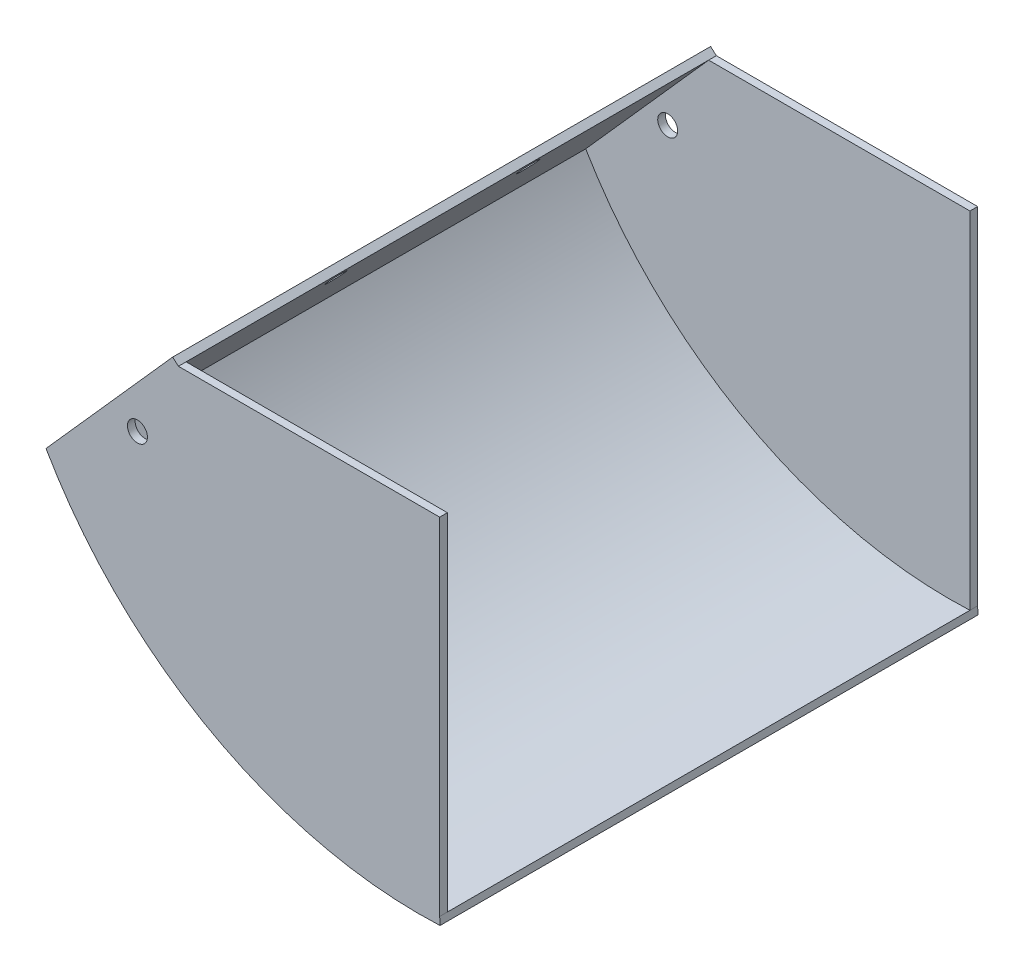
ISO-10303-21;
HEADER;
FILE_DESCRIPTION(('STEP AP214'),'2;1');
FILE_NAME('part.step','',(''),(''),'','','');
FILE_SCHEMA(('AUTOMOTIVE_DESIGN { 1 0 10303 214 1 1 1 1 }'));
ENDSEC;
DATA;
#1=APPLICATION_CONTEXT('core data for automotive mechanical design processes');
#2=APPLICATION_PROTOCOL_DEFINITION('international standard','automotive_design',2000,#1);
#3=PRODUCT_CONTEXT('',#1,'mechanical');
#4=PRODUCT('Part','Part','',(#3));
#5=PRODUCT_RELATED_PRODUCT_CATEGORY('part','',(#4));
#6=PRODUCT_DEFINITION_FORMATION('','',#4);
#7=PRODUCT_DEFINITION_CONTEXT('part definition',#1,'design');
#8=PRODUCT_DEFINITION('design','',#6,#7);
#9=PRODUCT_DEFINITION_SHAPE('','',#8);
#10=(LENGTH_UNIT() NAMED_UNIT(*) SI_UNIT(.MILLI.,.METRE.));
#11=(NAMED_UNIT(*) PLANE_ANGLE_UNIT() SI_UNIT($,.RADIAN.));
#12=(NAMED_UNIT(*) SI_UNIT($,.STERADIAN.) SOLID_ANGLE_UNIT());
#13=UNCERTAINTY_MEASURE_WITH_UNIT(LENGTH_MEASURE(1.E-05),#10,'distance_accuracy_value','');
#14=(GEOMETRIC_REPRESENTATION_CONTEXT(3) GLOBAL_UNCERTAINTY_ASSIGNED_CONTEXT((#13)) GLOBAL_UNIT_ASSIGNED_CONTEXT((#10,
#11,#12)) REPRESENTATION_CONTEXT('',''));
#15=CARTESIAN_POINT('',(0.,0.,0.));
#16=DIRECTION('',(0.,0.,1.));
#17=DIRECTION('',(1.,0.,0.));
#18=AXIS2_PLACEMENT_3D('',#15,#16,#17);
#19=CARTESIAN_POINT('',(11.7523691350774,4.87475765755079,-101.5));
#20=DIRECTION('',(0.,0.,-1.));
#21=DIRECTION('',(1.,0.,0.));
#22=AXIS2_PLACEMENT_3D('',#19,#20,#21);
#23=PLANE('',#22);
#24=CARTESIAN_POINT('',(-61.6593417472566,-35.0203309303676,-101.5));
#25=DIRECTION('',(0.,0.,-1.));
#26=DIRECTION('',(-1.,0.,0.));
#27=AXIS2_PLACEMENT_3D('',#24,#25,#26);
#28=CIRCLE('',#27,2.6);
#29=CARTESIAN_POINT('',(-64.2593417472566,-35.0203309303676,-101.5));
#30=VERTEX_POINT('',#29);
#31=EDGE_CURVE('E193',#30,#30,#28,.T.);
#32=ORIENTED_EDGE('',*,*,#31,.F.);
#33=EDGE_LOOP('',(#32));
#34=FACE_BOUND('',#33,.T.);
#35=DIRECTION('',(0.74740931868366,-0.66436383882992,0.));
#36=VECTOR('',#35,1.);
#37=CARTESIAN_POINT('',(-52.4948186373673,-13.6712723223402,-101.5));
#38=LINE('',#37,#36);
#39=CARTESIAN_POINT('',(-52.4948186373673,-13.6712723223402,-101.5));
#40=VERTEX_POINT('',#39);
#41=CARTESIAN_POINT('',(-51.,-15.,-101.5));
#42=VERTEX_POINT('',#41);
#43=EDGE_CURVE('E138',#40,#42,#38,.T.);
#44=ORIENTED_EDGE('',*,*,#43,.T.);
#45=DIRECTION('',(-1.,0.,0.));
#46=VECTOR('',#45,1.);
#47=CARTESIAN_POINT('',(-51.,-15.,-101.5));
#48=LINE('',#47,#46);
#49=CARTESIAN_POINT('',(17.,-15.,-101.5));
#50=VERTEX_POINT('',#49);
#51=EDGE_CURVE('E144',#50,#42,#48,.T.);
#52=ORIENTED_EDGE('',*,*,#51,.F.);
#53=DIRECTION('',(0.,1.,0.));
#54=VECTOR('',#53,1.);
#55=CARTESIAN_POINT('',(17.,-15.,-101.5));
#56=LINE('',#55,#54);
#57=CARTESIAN_POINT('',(16.9999999999999,-105.,-101.5));
#58=VERTEX_POINT('',#57);
#59=EDGE_CURVE('E141',#58,#50,#56,.T.);
#60=ORIENTED_EDGE('',*,*,#59,.F.);
#61=DIRECTION('',(0.0477057351356576,-0.998861433250462,0.));
#62=VECTOR('',#61,1.);
#63=CARTESIAN_POINT('',(16.9999999999999,-105.,-101.5));
#64=LINE('',#63,#62);
#65=CARTESIAN_POINT('',(17.0954114702712,-106.997722866501,-101.5));
#66=VERTEX_POINT('',#65);
#67=EDGE_CURVE('E125',#58,#66,#64,.T.);
#68=ORIENTED_EDGE('',*,*,#67,.T.);
#69=CARTESIAN_POINT('',(11.7523691350774,4.87475765755079,-101.5));
#70=DIRECTION('',(0.,0.,-1.));
#71=DIRECTION('',(-1.,0.,0.));
#72=AXIS2_PLACEMENT_3D('',#69,#70,#71);
#73=CIRCLE('',#72,112.);
#74=CARTESIAN_POINT('',(-85.4564064699669,-50.7530586340146,-101.5));
#75=VERTEX_POINT('',#74);
#76=EDGE_CURVE('E209',#75,#66,#73,.F.);
#77=ORIENTED_EDGE('',*,*,#76,.F.);
#78=DIRECTION('',(-0.66436383882992,-0.747409318683659,0.));
#79=VECTOR('',#78,1.);
#80=CARTESIAN_POINT('',(-52.4948186373673,-13.6712723223402,-101.5));
#81=LINE('',#80,#79);
#82=EDGE_CURVE('E225',#40,#75,#81,.T.);
#83=ORIENTED_EDGE('',*,*,#82,.F.);
#84=EDGE_LOOP('',(#44,#52,#60,#68,#77,#83));
#85=FACE_BOUND('',#84,.T.);
#86=ADVANCED_FACE('F40',(#34,#85),#23,.T.);
#87=CARTESIAN_POINT('',(-36.091868623584,-36.2794020537869,-6.49999999999999));
#88=DIRECTION('',(-0.747409318683659,0.66436383882992,0.));
#89=DIRECTION('',(-0.66436383882992,-0.747409318683659,0.));
#90=AXIS2_PLACEMENT_3D('',#87,#88,#89);
#91=CYLINDRICAL_SURFACE('',#90,2.5);
#92=CARTESIAN_POINT('',(-56.4810016703469,-18.1557282344421,-6.49999999999999));
#93=DIRECTION('',(-0.747409318683659,0.66436383882992,0.));
#94=DIRECTION('',(-0.66436383882992,-0.747409318683659,0.));
#95=AXIS2_PLACEMENT_3D('',#92,#93,#94);
#96=CIRCLE('',#95,2.5);
#97=CARTESIAN_POINT('',(-58.1419112674217,-20.0242515311513,-6.49999999999999));
#98=VERTEX_POINT('',#97);
#99=EDGE_CURVE('E192',#98,#98,#96,.T.);
#100=ORIENTED_EDGE('',*,*,#99,.T.);
#101=EDGE_LOOP('',(#100));
#102=FACE_BOUND('',#101,.T.);
#103=CARTESIAN_POINT('',(-54.9861830329795,-19.484455912102,-6.49999999999999));
#104=DIRECTION('',(-0.747409318683659,0.66436383882992,0.));
#105=DIRECTION('',(-0.66436383882992,-0.747409318683659,0.));
#106=AXIS2_PLACEMENT_3D('',#103,#104,#105);
#107=CIRCLE('',#106,2.5);
#108=CARTESIAN_POINT('',(-56.6470926300543,-21.3529792088111,-6.49999999999999));
#109=VERTEX_POINT('',#108);
#110=EDGE_CURVE('E202',#109,#109,#107,.T.);
#111=ORIENTED_EDGE('',*,*,#110,.F.);
#112=EDGE_LOOP('',(#111));
#113=FACE_BOUND('',#112,.T.);
#114=ADVANCED_FACE('F290',(#102,#113),#91,.F.);
#115=CARTESIAN_POINT('',(-36.091868623584,-36.2794020537869,-56.5));
#116=DIRECTION('',(-0.747409318683659,0.66436383882992,0.));
#117=DIRECTION('',(-0.66436383882992,-0.747409318683659,0.));
#118=AXIS2_PLACEMENT_3D('',#115,#116,#117);
#119=CYLINDRICAL_SURFACE('',#118,2.6);
#120=CARTESIAN_POINT('',(-56.4810016703469,-18.1557282344421,-56.5));
#121=DIRECTION('',(-0.747409318683659,0.66436383882992,0.));
#122=DIRECTION('',(-0.66436383882992,-0.747409318683659,0.));
#123=AXIS2_PLACEMENT_3D('',#120,#121,#122);
#124=CIRCLE('',#123,2.6);
#125=CARTESIAN_POINT('',(-58.2083476513047,-20.0989924630196,-56.5));
#126=VERTEX_POINT('',#125);
#127=EDGE_CURVE('E196',#126,#126,#124,.T.);
#128=ORIENTED_EDGE('',*,*,#127,.T.);
#129=EDGE_LOOP('',(#128));
#130=FACE_BOUND('',#129,.T.);
#131=CARTESIAN_POINT('',(-54.9861830329795,-19.484455912102,-56.5));
#132=DIRECTION('',(-0.747409318683659,0.66436383882992,0.));
#133=DIRECTION('',(-0.66436383882992,-0.747409318683659,0.));
#134=AXIS2_PLACEMENT_3D('',#131,#132,#133);
#135=CIRCLE('',#134,2.6);
#136=CARTESIAN_POINT('',(-56.7135290139373,-21.4277201406795,-56.5));
#137=VERTEX_POINT('',#136);
#138=EDGE_CURVE('E206',#137,#137,#135,.T.);
#139=ORIENTED_EDGE('',*,*,#138,.F.);
#140=EDGE_LOOP('',(#139));
#141=FACE_BOUND('',#140,.T.);
#142=ADVANCED_FACE('F303',(#130,#141),#119,.F.);
#143=CARTESIAN_POINT('',(16.9999999999999,-105.,-240.246242743244));
#144=DIRECTION('',(-0.998861433250462,-0.0477057351356576,0.));
#145=DIRECTION('',(0.0477057351356576,-0.998861433250462,0.));
#146=AXIS2_PLACEMENT_3D('',#143,#144,#145);
#147=PLANE('',#146);
#148=ORIENTED_EDGE('',*,*,#67,.F.);
#149=DIRECTION('',(0.,0.,1.));
#150=VECTOR('',#149,1.);
#151=CARTESIAN_POINT('',(17.,-105.,-101.5));
#152=LINE('',#151,#150);
#153=CARTESIAN_POINT('',(17.,-105.,-99.5));
#154=VERTEX_POINT('',#153);
#155=EDGE_CURVE('E130',#58,#154,#152,.T.);
#156=ORIENTED_EDGE('',*,*,#155,.T.);
#157=DIRECTION('',(0.,0.,1.));
#158=VECTOR('',#157,1.);
#159=CARTESIAN_POINT('',(16.9999999999999,-105.,-240.246242743244));
#160=LINE('',#159,#158);
#161=CARTESIAN_POINT('',(16.9999999999999,-105.,36.5));
#162=VERTEX_POINT('',#161);
#163=EDGE_CURVE('E221',#154,#162,#160,.T.);
#164=ORIENTED_EDGE('',*,*,#163,.T.);
#165=DIRECTION('',(0.,0.,-1.));
#166=VECTOR('',#165,1.);
#167=CARTESIAN_POINT('',(17.,-105.,38.5));
#168=LINE('',#167,#166);
#169=CARTESIAN_POINT('',(17.,-105.,38.5));
#170=VERTEX_POINT('',#169);
#171=EDGE_CURVE('E175',#170,#162,#168,.T.);
#172=ORIENTED_EDGE('',*,*,#171,.F.);
#173=DIRECTION('',(0.0477057351356576,-0.998861433250462,0.));
#174=VECTOR('',#173,1.);
#175=CARTESIAN_POINT('',(16.9999999999999,-105.,38.5));
#176=LINE('',#175,#174);
#177=CARTESIAN_POINT('',(17.0954114702712,-106.997722866501,38.5));
#178=VERTEX_POINT('',#177);
#179=EDGE_CURVE('E219',#170,#178,#176,.T.);
#180=ORIENTED_EDGE('',*,*,#179,.T.);
#181=DIRECTION('',(0.,0.,1.));
#182=VECTOR('',#181,1.);
#183=CARTESIAN_POINT('',(17.0954114702712,-106.997722866501,-240.246242743244));
#184=LINE('',#183,#182);
#185=EDGE_CURVE('E133',#66,#178,#184,.T.);
#186=ORIENTED_EDGE('',*,*,#185,.F.);
#187=EDGE_LOOP('',(#148,#156,#164,#172,#180,#186));
#188=FACE_BOUND('',#187,.T.);
#189=ADVANCED_FACE('F127',(#188),#147,.F.);
#190=CARTESIAN_POINT('',(11.7523691350774,4.87475765755079,-240.246242743244));
#191=DIRECTION('',(0.,0.,1.));
#192=DIRECTION('',(1.,0.,0.));
#193=AXIS2_PLACEMENT_3D('',#190,#191,#192);
#194=CYLINDRICAL_SURFACE('',#193,112.);
#195=DIRECTION('',(0.,0.,1.));
#196=VECTOR('',#195,1.);
#197=CARTESIAN_POINT('',(-85.4564064699669,-50.7530586340146,-240.246242743244));
#198=LINE('',#197,#196);
#199=CARTESIAN_POINT('',(-85.4564064699669,-50.7530586340146,38.5));
#200=VERTEX_POINT('',#199);
#201=EDGE_CURVE('E227',#75,#200,#198,.T.);
#202=ORIENTED_EDGE('',*,*,#201,.F.);
#203=ORIENTED_EDGE('',*,*,#76,.T.);
#204=ORIENTED_EDGE('',*,*,#185,.T.);
#205=CARTESIAN_POINT('',(11.7523691350774,4.87475765755079,38.5));
#206=DIRECTION('',(0.,0.,1.));
#207=DIRECTION('',(1.,0.,0.));
#208=AXIS2_PLACEMENT_3D('',#205,#206,#207);
#209=CIRCLE('',#208,112.);
#210=EDGE_CURVE('E213',#200,#178,#209,.T.);
#211=ORIENTED_EDGE('',*,*,#210,.F.);
#212=EDGE_LOOP('',(#202,#203,#204,#211));
#213=FACE_BOUND('',#212,.T.);
#214=ADVANCED_FACE('F259',(#213),#194,.T.);
#215=CARTESIAN_POINT('',(-52.4948186373673,-13.6712723223402,-240.246242743244));
#216=DIRECTION('',(-0.747409318683659,0.66436383882992,0.));
#217=DIRECTION('',(-0.66436383882992,-0.747409318683659,0.));
#218=AXIS2_PLACEMENT_3D('',#215,#216,#217);
#219=PLANE('',#218);
#220=ORIENTED_EDGE('',*,*,#127,.F.);
#221=EDGE_LOOP('',(#220));
#222=FACE_BOUND('',#221,.T.);
#223=ORIENTED_EDGE('',*,*,#99,.F.);
#224=EDGE_LOOP('',(#223));
#225=FACE_BOUND('',#224,.T.);
#226=DIRECTION('',(0.,0.,1.));
#227=VECTOR('',#226,1.);
#228=CARTESIAN_POINT('',(-52.4948186373673,-13.6712723223402,-240.246242743244));
#229=LINE('',#228,#227);
#230=CARTESIAN_POINT('',(-52.4948186373673,-13.6712723223402,38.5));
#231=VERTEX_POINT('',#230);
#232=EDGE_CURVE('E218',#40,#231,#229,.T.);
#233=ORIENTED_EDGE('',*,*,#232,.F.);
#234=ORIENTED_EDGE('',*,*,#82,.T.);
#235=ORIENTED_EDGE('',*,*,#201,.T.);
#236=DIRECTION('',(-0.66436383882992,-0.747409318683659,0.));
#237=VECTOR('',#236,1.);
#238=CARTESIAN_POINT('',(-52.4948186373673,-13.6712723223402,38.5));
#239=LINE('',#238,#237);
#240=EDGE_CURVE('E210',#231,#200,#239,.T.);
#241=ORIENTED_EDGE('',*,*,#240,.F.);
#242=EDGE_LOOP('',(#233,#234,#235,#241));
#243=FACE_BOUND('',#242,.T.);
#244=ADVANCED_FACE('F255',(#222,#225,#243),#219,.T.);
#245=CARTESIAN_POINT('',(-52.4948186373673,-13.6712723223402,-240.246242743244));
#246=DIRECTION('',(-0.66436383882992,-0.74740931868366,0.));
#247=DIRECTION('',(0.74740931868366,-0.66436383882992,0.));
#248=AXIS2_PLACEMENT_3D('',#245,#246,#247);
#249=PLANE('',#248);
#250=ORIENTED_EDGE('',*,*,#43,.F.);
#251=ORIENTED_EDGE('',*,*,#232,.T.);
#252=DIRECTION('',(0.74740931868366,-0.66436383882992,0.));
#253=VECTOR('',#252,1.);
#254=CARTESIAN_POINT('',(-52.4948186373673,-13.6712723223402,38.5));
#255=LINE('',#254,#253);
#256=CARTESIAN_POINT('',(-51.,-15.,38.5));
#257=VERTEX_POINT('',#256);
#258=EDGE_CURVE('E214',#231,#257,#255,.T.);
#259=ORIENTED_EDGE('',*,*,#258,.T.);
#260=DIRECTION('',(0.,0.,-1.));
#261=VECTOR('',#260,1.);
#262=CARTESIAN_POINT('',(-51.,-15.,38.5));
#263=LINE('',#262,#261);
#264=CARTESIAN_POINT('',(-51.,-15.,36.5));
#265=VERTEX_POINT('',#264);
#266=EDGE_CURVE('E166',#257,#265,#263,.T.);
#267=ORIENTED_EDGE('',*,*,#266,.T.);
#268=DIRECTION('',(0.,0.,1.));
#269=VECTOR('',#268,1.);
#270=CARTESIAN_POINT('',(-51.,-15.,-240.246242743244));
#271=LINE('',#270,#269);
#272=CARTESIAN_POINT('',(-51.,-15.,-99.5));
#273=VERTEX_POINT('',#272);
#274=EDGE_CURVE('E217',#273,#265,#271,.T.);
#275=ORIENTED_EDGE('',*,*,#274,.F.);
#276=DIRECTION('',(0.,0.,1.));
#277=VECTOR('',#276,1.);
#278=CARTESIAN_POINT('',(-51.,-15.,-101.5));
#279=LINE('',#278,#277);
#280=EDGE_CURVE('E161',#42,#273,#279,.T.);
#281=ORIENTED_EDGE('',*,*,#280,.F.);
#282=EDGE_LOOP('',(#250,#251,#259,#267,#275,#281));
#283=FACE_BOUND('',#282,.T.);
#284=ADVANCED_FACE('F250',(#283),#249,.F.);
#285=CARTESIAN_POINT('',(-51.,-15.,-101.5));
#286=DIRECTION('',(0.,-1.,0.));
#287=DIRECTION('',(0.,0.,1.));
#288=AXIS2_PLACEMENT_3D('',#285,#286,#287);
#289=PLANE('',#288);
#290=DIRECTION('',(-1.,0.,0.));
#291=VECTOR('',#290,1.);
#292=CARTESIAN_POINT('',(-51.,-15.,-99.5));
#293=LINE('',#292,#291);
#294=CARTESIAN_POINT('',(17.,-15.,-99.5));
#295=VERTEX_POINT('',#294);
#296=EDGE_CURVE('E148',#295,#273,#293,.T.);
#297=ORIENTED_EDGE('',*,*,#296,.F.);
#298=DIRECTION('',(0.,0.,1.));
#299=VECTOR('',#298,1.);
#300=CARTESIAN_POINT('',(17.,-15.,-101.5));
#301=LINE('',#300,#299);
#302=EDGE_CURVE('E156',#50,#295,#301,.T.);
#303=ORIENTED_EDGE('',*,*,#302,.F.);
#304=ORIENTED_EDGE('',*,*,#51,.T.);
#305=ORIENTED_EDGE('',*,*,#280,.T.);
#306=EDGE_LOOP('',(#297,#303,#304,#305));
#307=FACE_BOUND('',#306,.T.);
#308=ADVANCED_FACE('F247',(#307),#289,.F.);
#309=CARTESIAN_POINT('',(17.,-15.,-101.5));
#310=DIRECTION('',(-1.,0.,0.));
#311=DIRECTION('',(0.,0.,-1.));
#312=AXIS2_PLACEMENT_3D('',#309,#310,#311);
#313=PLANE('',#312);
#314=DIRECTION('',(0.,1.,0.));
#315=VECTOR('',#314,1.);
#316=CARTESIAN_POINT('',(17.,-15.,-99.5));
#317=LINE('',#316,#315);
#318=EDGE_CURVE('E153',#154,#295,#317,.T.);
#319=ORIENTED_EDGE('',*,*,#318,.F.);
#320=ORIENTED_EDGE('',*,*,#155,.F.);
#321=ORIENTED_EDGE('',*,*,#59,.T.);
#322=ORIENTED_EDGE('',*,*,#302,.T.);
#323=EDGE_LOOP('',(#319,#320,#321,#322));
#324=FACE_BOUND('',#323,.T.);
#325=ADVANCED_FACE('F151',(#324),#313,.F.);
#326=CARTESIAN_POINT('',(11.7523691350774,4.87475765755079,-240.246242743244));
#327=DIRECTION('',(0.,0.,1.));
#328=DIRECTION('',(1.,0.,0.));
#329=AXIS2_PLACEMENT_3D('',#326,#327,#328);
#330=CYLINDRICAL_SURFACE('',#329,110.);
#331=DIRECTION('',(0.,0.,1.));
#332=VECTOR('',#331,1.);
#333=CARTESIAN_POINT('',(-83.,-51.,-240.246242743244));
#334=LINE('',#333,#332);
#335=CARTESIAN_POINT('',(-83.,-51.,-99.5));
#336=VERTEX_POINT('',#335);
#337=CARTESIAN_POINT('',(-83.,-51.,36.5));
#338=VERTEX_POINT('',#337);
#339=EDGE_CURVE('E233',#336,#338,#334,.T.);
#340=ORIENTED_EDGE('',*,*,#339,.T.);
#341=CARTESIAN_POINT('',(11.7523691350774,4.87475765755079,36.5));
#342=DIRECTION('',(0.,0.,1.));
#343=DIRECTION('',(1.,0.,0.));
#344=AXIS2_PLACEMENT_3D('',#341,#342,#343);
#345=CIRCLE('',#344,110.);
#346=EDGE_CURVE('E159',#338,#162,#345,.T.);
#347=ORIENTED_EDGE('',*,*,#346,.T.);
#348=ORIENTED_EDGE('',*,*,#163,.F.);
#349=CARTESIAN_POINT('',(11.7523691350774,4.87475765755079,-99.5));
#350=DIRECTION('',(0.,0.,1.));
#351=DIRECTION('',(1.,0.,0.));
#352=AXIS2_PLACEMENT_3D('',#349,#350,#351);
#353=CIRCLE('',#352,110.);
#354=EDGE_CURVE('E241',#336,#154,#353,.T.);
#355=ORIENTED_EDGE('',*,*,#354,.F.);
#356=EDGE_LOOP('',(#340,#347,#348,#355));
#357=FACE_BOUND('',#356,.T.);
#358=ADVANCED_FACE('F267',(#357),#330,.F.);
#359=CARTESIAN_POINT('',(17.,-15.,38.5));
#360=DIRECTION('',(-1.,0.,0.));
#361=DIRECTION('',(0.,0.,1.));
#362=AXIS2_PLACEMENT_3D('',#359,#360,#361);
#363=PLANE('',#362);
#364=DIRECTION('',(0.,1.,0.));
#365=VECTOR('',#364,1.);
#366=CARTESIAN_POINT('',(17.,-15.,36.5));
#367=LINE('',#366,#365);
#368=CARTESIAN_POINT('',(17.,-15.,36.5));
#369=VERTEX_POINT('',#368);
#370=EDGE_CURVE('E73',#162,#369,#367,.T.);
#371=ORIENTED_EDGE('',*,*,#370,.T.);
#372=DIRECTION('',(0.,0.,-1.));
#373=VECTOR('',#372,1.);
#374=CARTESIAN_POINT('',(17.,-15.,38.5));
#375=LINE('',#374,#373);
#376=CARTESIAN_POINT('',(17.,-15.,38.5));
#377=VERTEX_POINT('',#376);
#378=EDGE_CURVE('E174',#377,#369,#375,.T.);
#379=ORIENTED_EDGE('',*,*,#378,.F.);
#380=DIRECTION('',(0.,1.,0.));
#381=VECTOR('',#380,1.);
#382=CARTESIAN_POINT('',(17.,-15.,38.5));
#383=LINE('',#382,#381);
#384=EDGE_CURVE('E81',#170,#377,#383,.T.);
#385=ORIENTED_EDGE('',*,*,#384,.F.);
#386=ORIENTED_EDGE('',*,*,#171,.T.);
#387=EDGE_LOOP('',(#371,#379,#385,#386));
#388=FACE_BOUND('',#387,.T.);
#389=ADVANCED_FACE('F42',(#388),#363,.F.);
#390=CARTESIAN_POINT('',(-51.,-15.,38.5));
#391=DIRECTION('',(0.,-1.,0.));
#392=DIRECTION('',(0.,0.,-1.));
#393=AXIS2_PLACEMENT_3D('',#390,#391,#392);
#394=PLANE('',#393);
#395=DIRECTION('',(-1.,0.,0.));
#396=VECTOR('',#395,1.);
#397=CARTESIAN_POINT('',(-51.,-15.,36.5));
#398=LINE('',#397,#396);
#399=EDGE_CURVE('E78',#369,#265,#398,.T.);
#400=ORIENTED_EDGE('',*,*,#399,.T.);
#401=ORIENTED_EDGE('',*,*,#266,.F.);
#402=DIRECTION('',(-1.,0.,0.));
#403=VECTOR('',#402,1.);
#404=CARTESIAN_POINT('',(-51.,-15.,38.5));
#405=LINE('',#404,#403);
#406=EDGE_CURVE('E58',#377,#257,#405,.T.);
#407=ORIENTED_EDGE('',*,*,#406,.F.);
#408=ORIENTED_EDGE('',*,*,#378,.T.);
#409=EDGE_LOOP('',(#400,#401,#407,#408));
#410=FACE_BOUND('',#409,.T.);
#411=ADVANCED_FACE('F268',(#410),#394,.F.);
#412=CARTESIAN_POINT('',(-51.,-15.,-240.246242743244));
#413=DIRECTION('',(-0.747409318683659,0.66436383882992,0.));
#414=DIRECTION('',(-0.66436383882992,-0.747409318683659,0.));
#415=AXIS2_PLACEMENT_3D('',#412,#413,#414);
#416=PLANE('',#415);
#417=ORIENTED_EDGE('',*,*,#138,.T.);
#418=EDGE_LOOP('',(#417));
#419=FACE_BOUND('',#418,.T.);
#420=ORIENTED_EDGE('',*,*,#110,.T.);
#421=EDGE_LOOP('',(#420));
#422=FACE_BOUND('',#421,.T.);
#423=ORIENTED_EDGE('',*,*,#274,.T.);
#424=DIRECTION('',(-0.66436383882992,-0.74740931868366,0.));
#425=VECTOR('',#424,1.);
#426=CARTESIAN_POINT('',(-51.,-15.,36.5));
#427=LINE('',#426,#425);
#428=EDGE_CURVE('E155',#265,#338,#427,.T.);
#429=ORIENTED_EDGE('',*,*,#428,.T.);
#430=ORIENTED_EDGE('',*,*,#339,.F.);
#431=DIRECTION('',(-0.66436383882992,-0.74740931868366,0.));
#432=VECTOR('',#431,1.);
#433=CARTESIAN_POINT('',(-51.,-15.,-99.5));
#434=LINE('',#433,#432);
#435=EDGE_CURVE('E137',#273,#336,#434,.T.);
#436=ORIENTED_EDGE('',*,*,#435,.F.);
#437=EDGE_LOOP('',(#423,#429,#430,#436));
#438=FACE_BOUND('',#437,.T.);
#439=ADVANCED_FACE('F262',(#419,#422,#438),#416,.F.);
#440=CARTESIAN_POINT('',(11.7523691350774,4.87475765755079,36.5));
#441=DIRECTION('',(0.,0.,1.));
#442=DIRECTION('',(1.,0.,0.));
#443=AXIS2_PLACEMENT_3D('',#440,#441,#442);
#444=PLANE('',#443);
#445=CARTESIAN_POINT('',(-61.6593417472566,-35.0203309303676,36.5));
#446=DIRECTION('',(0.,0.,1.));
#447=DIRECTION('',(1.,0.,0.));
#448=AXIS2_PLACEMENT_3D('',#445,#446,#447);
#449=CIRCLE('',#448,2.6);
#450=CARTESIAN_POINT('',(-59.0593417472566,-35.0203309303676,36.5));
#451=VERTEX_POINT('',#450);
#452=EDGE_CURVE('E44',#451,#451,#449,.T.);
#453=ORIENTED_EDGE('',*,*,#452,.T.);
#454=EDGE_LOOP('',(#453));
#455=FACE_BOUND('',#454,.T.);
#456=ORIENTED_EDGE('',*,*,#428,.F.);
#457=ORIENTED_EDGE('',*,*,#399,.F.);
#458=ORIENTED_EDGE('',*,*,#370,.F.);
#459=ORIENTED_EDGE('',*,*,#346,.F.);
#460=EDGE_LOOP('',(#456,#457,#458,#459));
#461=FACE_BOUND('',#460,.T.);
#462=ADVANCED_FACE('F179',(#455,#461),#444,.F.);
#463=CARTESIAN_POINT('',(11.7523691350774,4.87475765755079,-99.5));
#464=DIRECTION('',(0.,0.,-1.));
#465=DIRECTION('',(1.,0.,0.));
#466=AXIS2_PLACEMENT_3D('',#463,#464,#465);
#467=PLANE('',#466);
#468=CARTESIAN_POINT('',(-61.6593417472566,-35.0203309303676,-99.5));
#469=DIRECTION('',(0.,0.,1.));
#470=DIRECTION('',(1.,0.,0.));
#471=AXIS2_PLACEMENT_3D('',#468,#469,#470);
#472=CIRCLE('',#471,2.6);
#473=CARTESIAN_POINT('',(-64.2593417472566,-35.0203309303676,-99.5));
#474=VERTEX_POINT('',#473);
#475=EDGE_CURVE('E11',#474,#474,#472,.T.);
#476=ORIENTED_EDGE('',*,*,#475,.F.);
#477=EDGE_LOOP('',(#476));
#478=FACE_BOUND('',#477,.T.);
#479=ORIENTED_EDGE('',*,*,#435,.T.);
#480=ORIENTED_EDGE('',*,*,#354,.T.);
#481=ORIENTED_EDGE('',*,*,#318,.T.);
#482=ORIENTED_EDGE('',*,*,#296,.T.);
#483=EDGE_LOOP('',(#479,#480,#481,#482));
#484=FACE_BOUND('',#483,.T.);
#485=ADVANCED_FACE('F265',(#478,#484),#467,.F.);
#486=CARTESIAN_POINT('',(11.7523691350774,4.87475765755079,38.5));
#487=DIRECTION('',(0.,0.,1.));
#488=DIRECTION('',(1.,0.,0.));
#489=AXIS2_PLACEMENT_3D('',#486,#487,#488);
#490=PLANE('',#489);
#491=CARTESIAN_POINT('',(-61.6593417472566,-35.0203309303676,38.5));
#492=DIRECTION('',(0.,0.,1.));
#493=DIRECTION('',(1.,0.,0.));
#494=AXIS2_PLACEMENT_3D('',#491,#492,#493);
#495=CIRCLE('',#494,2.6);
#496=CARTESIAN_POINT('',(-59.0593417472566,-35.0203309303676,38.5));
#497=VERTEX_POINT('',#496);
#498=EDGE_CURVE('E190',#497,#497,#495,.T.);
#499=ORIENTED_EDGE('',*,*,#498,.F.);
#500=EDGE_LOOP('',(#499));
#501=FACE_BOUND('',#500,.T.);
#502=ORIENTED_EDGE('',*,*,#406,.T.);
#503=ORIENTED_EDGE('',*,*,#258,.F.);
#504=ORIENTED_EDGE('',*,*,#240,.T.);
#505=ORIENTED_EDGE('',*,*,#210,.T.);
#506=ORIENTED_EDGE('',*,*,#179,.F.);
#507=ORIENTED_EDGE('',*,*,#384,.T.);
#508=EDGE_LOOP('',(#502,#503,#504,#505,#506,#507));
#509=FACE_BOUND('',#508,.T.);
#510=ADVANCED_FACE('F186',(#501,#509),#490,.T.);
#511=CARTESIAN_POINT('',(-61.6593417472566,-35.0203309303676,36.6));
#512=DIRECTION('',(0.,0.,1.));
#513=DIRECTION('',(1.,0.,0.));
#514=AXIS2_PLACEMENT_3D('',#511,#512,#513);
#515=CYLINDRICAL_SURFACE('',#514,2.6);
#516=CARTESIAN_POINT('',(-59.0593417472566,-35.0203309303676,36.5));
#517=CARTESIAN_POINT('',(-59.0593417472566,-35.0203309303676,36.5208333333333));
#518=CARTESIAN_POINT('',(-59.0593417472566,-35.0203309303676,36.5416666666667));
#519=CARTESIAN_POINT('',(-59.0593417472566,-35.0203309303676,36.5833333333333));
#520=CARTESIAN_POINT('',(-59.0593417472566,-35.0203309303676,36.6041666666667));
#521=CARTESIAN_POINT('',(-59.0593417472566,-35.0203309303676,36.6458333333333));
#522=CARTESIAN_POINT('',(-59.0593417472566,-35.0203309303676,36.6666666666667));
#523=CARTESIAN_POINT('',(-59.0593417472566,-35.0203309303676,36.7083333333333));
#524=CARTESIAN_POINT('',(-59.0593417472566,-35.0203309303676,36.7291666666667));
#525=CARTESIAN_POINT('',(-59.0593417472566,-35.0203309303676,36.7708333333333));
#526=CARTESIAN_POINT('',(-59.0593417472566,-35.0203309303676,36.7916666666667));
#527=CARTESIAN_POINT('',(-59.0593417472566,-35.0203309303676,36.8333333333333));
#528=CARTESIAN_POINT('',(-59.0593417472566,-35.0203309303676,36.8541666666667));
#529=CARTESIAN_POINT('',(-59.0593417472566,-35.0203309303676,36.8958333333333));
#530=CARTESIAN_POINT('',(-59.0593417472566,-35.0203309303676,36.9166666666667));
#531=CARTESIAN_POINT('',(-59.0593417472566,-35.0203309303676,36.9583333333333));
#532=CARTESIAN_POINT('',(-59.0593417472566,-35.0203309303676,36.9791666666667));
#533=CARTESIAN_POINT('',(-59.0593417472566,-35.0203309303676,37.0208333333333));
#534=CARTESIAN_POINT('',(-59.0593417472566,-35.0203309303676,37.0416666666667));
#535=CARTESIAN_POINT('',(-59.0593417472566,-35.0203309303676,37.0833333333333));
#536=CARTESIAN_POINT('',(-59.0593417472566,-35.0203309303676,37.1041666666667));
#537=CARTESIAN_POINT('',(-59.0593417472566,-35.0203309303676,37.1458333333333));
#538=CARTESIAN_POINT('',(-59.0593417472566,-35.0203309303676,37.1666666666667));
#539=CARTESIAN_POINT('',(-59.0593417472566,-35.0203309303676,37.2083333333333));
#540=CARTESIAN_POINT('',(-59.0593417472566,-35.0203309303676,37.2291666666667));
#541=CARTESIAN_POINT('',(-59.0593417472566,-35.0203309303676,37.2708333333333));
#542=CARTESIAN_POINT('',(-59.0593417472566,-35.0203309303676,37.2916666666667));
#543=CARTESIAN_POINT('',(-59.0593417472566,-35.0203309303676,37.3333333333333));
#544=CARTESIAN_POINT('',(-59.0593417472566,-35.0203309303676,37.3541666666667));
#545=CARTESIAN_POINT('',(-59.0593417472566,-35.0203309303676,37.3958333333333));
#546=CARTESIAN_POINT('',(-59.0593417472566,-35.0203309303676,37.4166666666667));
#547=CARTESIAN_POINT('',(-59.0593417472566,-35.0203309303676,37.4583333333333));
#548=CARTESIAN_POINT('',(-59.0593417472566,-35.0203309303676,37.4791666666667));
#549=CARTESIAN_POINT('',(-59.0593417472566,-35.0203309303676,37.5208333333333));
#550=CARTESIAN_POINT('',(-59.0593417472566,-35.0203309303676,37.5416666666667));
#551=CARTESIAN_POINT('',(-59.0593417472566,-35.0203309303676,37.5833333333333));
#552=CARTESIAN_POINT('',(-59.0593417472566,-35.0203309303676,37.6041666666667));
#553=CARTESIAN_POINT('',(-59.0593417472566,-35.0203309303676,37.6458333333333));
#554=CARTESIAN_POINT('',(-59.0593417472566,-35.0203309303676,37.6666666666667));
#555=CARTESIAN_POINT('',(-59.0593417472566,-35.0203309303676,37.7083333333333));
#556=CARTESIAN_POINT('',(-59.0593417472566,-35.0203309303676,37.7291666666667));
#557=CARTESIAN_POINT('',(-59.0593417472566,-35.0203309303676,37.7708333333333));
#558=CARTESIAN_POINT('',(-59.0593417472566,-35.0203309303676,37.7916666666667));
#559=CARTESIAN_POINT('',(-59.0593417472566,-35.0203309303676,37.8333333333333));
#560=CARTESIAN_POINT('',(-59.0593417472566,-35.0203309303676,37.8541666666667));
#561=CARTESIAN_POINT('',(-59.0593417472566,-35.0203309303676,37.8958333333333));
#562=CARTESIAN_POINT('',(-59.0593417472566,-35.0203309303676,37.9166666666667));
#563=CARTESIAN_POINT('',(-59.0593417472566,-35.0203309303676,37.9583333333333));
#564=CARTESIAN_POINT('',(-59.0593417472566,-35.0203309303676,37.9791666666667));
#565=CARTESIAN_POINT('',(-59.0593417472566,-35.0203309303676,38.0208333333333));
#566=CARTESIAN_POINT('',(-59.0593417472566,-35.0203309303676,38.0416666666667));
#567=CARTESIAN_POINT('',(-59.0593417472566,-35.0203309303676,38.0833333333333));
#568=CARTESIAN_POINT('',(-59.0593417472566,-35.0203309303676,38.1041666666667));
#569=CARTESIAN_POINT('',(-59.0593417472566,-35.0203309303676,38.1458333333333));
#570=CARTESIAN_POINT('',(-59.0593417472566,-35.0203309303676,38.1666666666667));
#571=CARTESIAN_POINT('',(-59.0593417472566,-35.0203309303676,38.2083333333333));
#572=CARTESIAN_POINT('',(-59.0593417472566,-35.0203309303676,38.2291666666667));
#573=CARTESIAN_POINT('',(-59.0593417472566,-35.0203309303676,38.2708333333333));
#574=CARTESIAN_POINT('',(-59.0593417472566,-35.0203309303676,38.2916666666667));
#575=CARTESIAN_POINT('',(-59.0593417472566,-35.0203309303676,38.3333333333333));
#576=CARTESIAN_POINT('',(-59.0593417472566,-35.0203309303676,38.3541666666667));
#577=CARTESIAN_POINT('',(-59.0593417472566,-35.0203309303676,38.3958333333333));
#578=CARTESIAN_POINT('',(-59.0593417472566,-35.0203309303676,38.4166666666667));
#579=CARTESIAN_POINT('',(-59.0593417472566,-35.0203309303676,38.4583333333333));
#580=CARTESIAN_POINT('',(-59.0593417472566,-35.0203309303676,38.4791666666667));
#581=CARTESIAN_POINT('',(-59.0593417472566,-35.0203309303676,38.5));
#582=B_SPLINE_CURVE_WITH_KNOTS('',3,(#516,#517,#518,#519,#520,#521,#522,#523,#524,#525,#526,
#527,#528,#529,#530,#531,#532,#533,#534,#535,#536,#537,#538,#539,#540,#541,#542,#543,#544,#545,
#546,#547,#548,#549,#550,#551,#552,#553,#554,#555,#556,#557,#558,#559,#560,#561,#562,#563,#564,
#565,#566,#567,#568,#569,#570,#571,#572,#573,#574,#575,#576,#577,#578,#579,#580,#581),
.UNSPECIFIED.,.F.,.F.,(4,2,2,2,2,2,2,2,2,2,2,2,2,2,2,2,2,2,2,2,2,2,2,2,2,2,2,2,2,2,2,2,4),(0.,
0.0625000000000001,0.125,0.1875,0.25,0.3125,0.375,0.4375,0.5,0.5625,0.624999999999994,
0.687500000000001,0.750000000000001,0.812500000000001,0.875000000000001,0.937500000000001,1.,
1.0625,1.12499999999999,1.1875,1.24999999999999,1.3125,1.37499999999999,1.4375,1.5,1.5625,1.625,
1.6875,1.75,1.8125,1.875,1.9375,2.),.UNSPECIFIED.);
#583=EDGE_CURVE('BSEAM182',#451,#497,#582,.T.);
#584=ORIENTED_EDGE('',*,*,#452,.F.);
#585=ORIENTED_EDGE('',*,*,#498,.T.);
#586=ORIENTED_EDGE('',*,*,#583,.T.);
#587=ORIENTED_EDGE('',*,*,#583,.F.);
#588=EDGE_LOOP('',(#584,#586,#585,#587));
#589=FACE_BOUND('',#588,.T.);
#590=ADVANCED_FACE('F182',(#589),#515,.F.);
#591=CARTESIAN_POINT('',(-61.6593417472566,-35.0203309303676,-99.6));
#592=DIRECTION('',(0.,0.,-1.));
#593=DIRECTION('',(-1.,0.,0.));
#594=AXIS2_PLACEMENT_3D('',#591,#592,#593);
#595=CYLINDRICAL_SURFACE('',#594,2.6);
#596=CARTESIAN_POINT('',(-64.2593417472566,-35.0203309303676,-99.5));
#597=CARTESIAN_POINT('',(-64.2593417472566,-35.0203309303676,-99.5208333333334));
#598=CARTESIAN_POINT('',(-64.2593417472566,-35.0203309303676,-99.5416666666667));
#599=CARTESIAN_POINT('',(-64.2593417472566,-35.0203309303676,-99.5833333333333));
#600=CARTESIAN_POINT('',(-64.2593417472566,-35.0203309303676,-99.6041666666667));
#601=CARTESIAN_POINT('',(-64.2593417472566,-35.0203309303676,-99.6458333333333));
#602=CARTESIAN_POINT('',(-64.2593417472566,-35.0203309303676,-99.6666666666667));
#603=CARTESIAN_POINT('',(-64.2593417472566,-35.0203309303676,-99.7083333333333));
#604=CARTESIAN_POINT('',(-64.2593417472566,-35.0203309303676,-99.7291666666667));
#605=CARTESIAN_POINT('',(-64.2593417472566,-35.0203309303676,-99.7708333333333));
#606=CARTESIAN_POINT('',(-64.2593417472566,-35.0203309303676,-99.7916666666667));
#607=CARTESIAN_POINT('',(-64.2593417472566,-35.0203309303676,-99.8333333333333));
#608=CARTESIAN_POINT('',(-64.2593417472566,-35.0203309303676,-99.8541666666667));
#609=CARTESIAN_POINT('',(-64.2593417472566,-35.0203309303676,-99.8958333333333));
#610=CARTESIAN_POINT('',(-64.2593417472566,-35.0203309303676,-99.9166666666667));
#611=CARTESIAN_POINT('',(-64.2593417472566,-35.0203309303676,-99.9583333333333));
#612=CARTESIAN_POINT('',(-64.2593417472566,-35.0203309303676,-99.9791666666667));
#613=CARTESIAN_POINT('',(-64.2593417472566,-35.0203309303676,-100.020833333333));
#614=CARTESIAN_POINT('',(-64.2593417472566,-35.0203309303676,-100.041666666667));
#615=CARTESIAN_POINT('',(-64.2593417472566,-35.0203309303676,-100.083333333333));
#616=CARTESIAN_POINT('',(-64.2593417472566,-35.0203309303676,-100.104166666667));
#617=CARTESIAN_POINT('',(-64.2593417472566,-35.0203309303676,-100.145833333333));
#618=CARTESIAN_POINT('',(-64.2593417472566,-35.0203309303676,-100.166666666667));
#619=CARTESIAN_POINT('',(-64.2593417472566,-35.0203309303676,-100.208333333333));
#620=CARTESIAN_POINT('',(-64.2593417472566,-35.0203309303676,-100.229166666667));
#621=CARTESIAN_POINT('',(-64.2593417472566,-35.0203309303676,-100.270833333333));
#622=CARTESIAN_POINT('',(-64.2593417472566,-35.0203309303676,-100.291666666667));
#623=CARTESIAN_POINT('',(-64.2593417472566,-35.0203309303676,-100.333333333333));
#624=CARTESIAN_POINT('',(-64.2593417472566,-35.0203309303676,-100.354166666667));
#625=CARTESIAN_POINT('',(-64.2593417472566,-35.0203309303676,-100.395833333333));
#626=CARTESIAN_POINT('',(-64.2593417472566,-35.0203309303676,-100.416666666667));
#627=CARTESIAN_POINT('',(-64.2593417472566,-35.0203309303676,-100.458333333333));
#628=CARTESIAN_POINT('',(-64.2593417472566,-35.0203309303676,-100.479166666667));
#629=CARTESIAN_POINT('',(-64.2593417472566,-35.0203309303676,-100.520833333333));
#630=CARTESIAN_POINT('',(-64.2593417472566,-35.0203309303676,-100.541666666667));
#631=CARTESIAN_POINT('',(-64.2593417472566,-35.0203309303676,-100.583333333333));
#632=CARTESIAN_POINT('',(-64.2593417472566,-35.0203309303676,-100.604166666667));
#633=CARTESIAN_POINT('',(-64.2593417472566,-35.0203309303676,-100.645833333333));
#634=CARTESIAN_POINT('',(-64.2593417472566,-35.0203309303676,-100.666666666667));
#635=CARTESIAN_POINT('',(-64.2593417472566,-35.0203309303676,-100.708333333333));
#636=CARTESIAN_POINT('',(-64.2593417472566,-35.0203309303676,-100.729166666667));
#637=CARTESIAN_POINT('',(-64.2593417472566,-35.0203309303676,-100.770833333333));
#638=CARTESIAN_POINT('',(-64.2593417472566,-35.0203309303676,-100.791666666667));
#639=CARTESIAN_POINT('',(-64.2593417472566,-35.0203309303676,-100.833333333333));
#640=CARTESIAN_POINT('',(-64.2593417472566,-35.0203309303676,-100.854166666667));
#641=CARTESIAN_POINT('',(-64.2593417472566,-35.0203309303676,-100.895833333333));
#642=CARTESIAN_POINT('',(-64.2593417472566,-35.0203309303676,-100.916666666667));
#643=CARTESIAN_POINT('',(-64.2593417472566,-35.0203309303676,-100.958333333333));
#644=CARTESIAN_POINT('',(-64.2593417472566,-35.0203309303676,-100.979166666667));
#645=CARTESIAN_POINT('',(-64.2593417472566,-35.0203309303676,-101.020833333333));
#646=CARTESIAN_POINT('',(-64.2593417472566,-35.0203309303676,-101.041666666667));
#647=CARTESIAN_POINT('',(-64.2593417472566,-35.0203309303676,-101.083333333333));
#648=CARTESIAN_POINT('',(-64.2593417472566,-35.0203309303676,-101.104166666667));
#649=CARTESIAN_POINT('',(-64.2593417472566,-35.0203309303676,-101.145833333333));
#650=CARTESIAN_POINT('',(-64.2593417472566,-35.0203309303676,-101.166666666667));
#651=CARTESIAN_POINT('',(-64.2593417472566,-35.0203309303676,-101.208333333333));
#652=CARTESIAN_POINT('',(-64.2593417472566,-35.0203309303676,-101.229166666667));
#653=CARTESIAN_POINT('',(-64.2593417472566,-35.0203309303676,-101.270833333333));
#654=CARTESIAN_POINT('',(-64.2593417472566,-35.0203309303676,-101.291666666667));
#655=CARTESIAN_POINT('',(-64.2593417472566,-35.0203309303676,-101.333333333333));
#656=CARTESIAN_POINT('',(-64.2593417472566,-35.0203309303676,-101.354166666667));
#657=CARTESIAN_POINT('',(-64.2593417472566,-35.0203309303676,-101.395833333333));
#658=CARTESIAN_POINT('',(-64.2593417472566,-35.0203309303676,-101.416666666667));
#659=CARTESIAN_POINT('',(-64.2593417472566,-35.0203309303676,-101.458333333333));
#660=CARTESIAN_POINT('',(-64.2593417472566,-35.0203309303676,-101.479166666667));
#661=CARTESIAN_POINT('',(-64.2593417472566,-35.0203309303676,-101.5));
#662=B_SPLINE_CURVE_WITH_KNOTS('',3,(#596,#597,#598,#599,#600,#601,#602,#603,#604,#605,#606,
#607,#608,#609,#610,#611,#612,#613,#614,#615,#616,#617,#618,#619,#620,#621,#622,#623,#624,#625,
#626,#627,#628,#629,#630,#631,#632,#633,#634,#635,#636,#637,#638,#639,#640,#641,#642,#643,#644,
#645,#646,#647,#648,#649,#650,#651,#652,#653,#654,#655,#656,#657,#658,#659,#660,#661),
.UNSPECIFIED.,.F.,.F.,(4,2,2,2,2,2,2,2,2,2,2,2,2,2,2,2,2,2,2,2,2,2,2,2,2,2,2,2,2,2,2,2,4),(0.,
0.0624999999999931,0.124999999999986,0.187499999999993,0.249999999999986,0.312499999999993,
0.374999999999986,0.437499999999993,0.499999999999987,0.562499999999994,0.624999999999987,
0.687499999999994,0.749999999999987,0.812499999999994,0.874999999999987,0.937499999999994,
0.999999999999987,1.06249999999998,1.12499999999999,1.18749999999998,1.24999999999999,
1.31249999999998,1.37499999999999,1.43749999999998,1.49999999999999,1.56249999999998,
1.62499999999999,1.68749999999998,1.74999999999999,1.81249999999998,1.87499999999999,
1.93749999999998,1.99999999999997),.UNSPECIFIED.);
#663=EDGE_CURVE('BSEAM185',#474,#30,#662,.T.);
#664=ORIENTED_EDGE('',*,*,#475,.T.);
#665=ORIENTED_EDGE('',*,*,#31,.T.);
#666=ORIENTED_EDGE('',*,*,#663,.T.);
#667=ORIENTED_EDGE('',*,*,#663,.F.);
#668=EDGE_LOOP('',(#664,#666,#665,#667));
#669=FACE_BOUND('',#668,.T.);
#670=ADVANCED_FACE('F185',(#669),#595,.F.);
#671=CLOSED_SHELL('',(#86,#114,#142,#189,#214,#244,#284,#308,#325,#358,#389,#411,#439,#462,#485,
#510,#590,#670));
#672=MANIFOLD_SOLID_BREP('B2',#671);
#673=ADVANCED_BREP_SHAPE_REPRESENTATION('',(#18,#672),#14);
#674=SHAPE_DEFINITION_REPRESENTATION(#9,#673);
ENDSEC;
END-ISO-10303-21;
